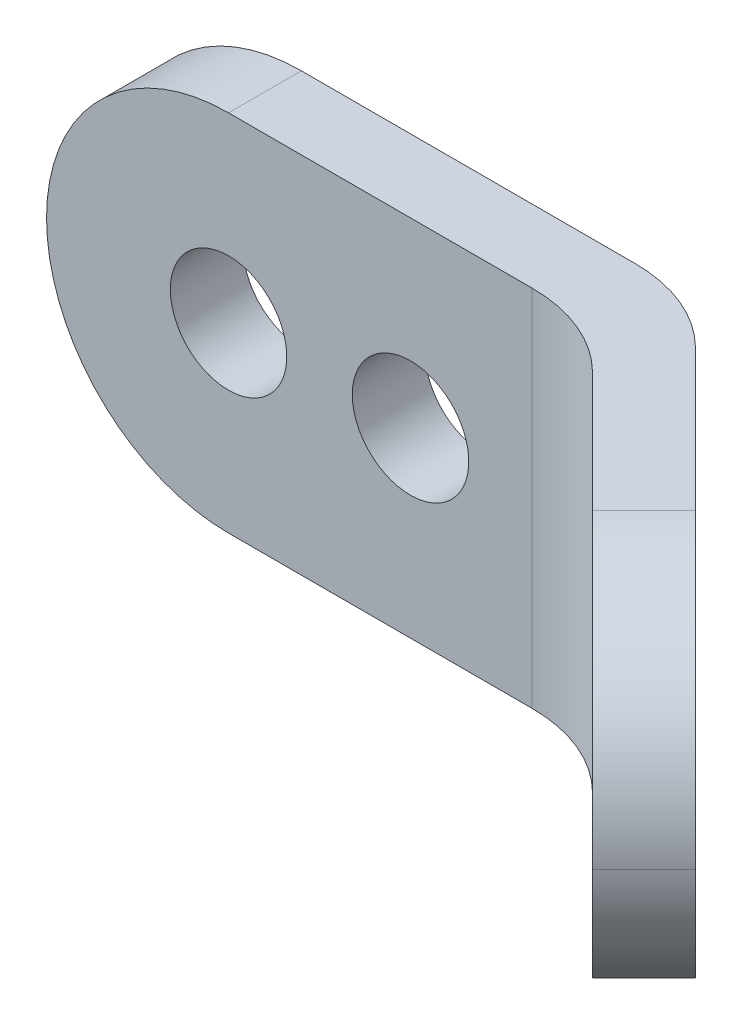
ISO-10303-21;
HEADER;
FILE_DESCRIPTION(('STEP AP214'),'2;1');
FILE_NAME('part.step','',(''),(''),'','','');
FILE_SCHEMA(('AUTOMOTIVE_DESIGN { 1 0 10303 214 1 1 1 1 }'));
ENDSEC;
DATA;
#1=APPLICATION_CONTEXT('core data for automotive mechanical design processes');
#2=APPLICATION_PROTOCOL_DEFINITION('international standard','automotive_design',2000,#1);
#3=PRODUCT_CONTEXT('',#1,'mechanical');
#4=PRODUCT('Part','Part','',(#3));
#5=PRODUCT_RELATED_PRODUCT_CATEGORY('part','',(#4));
#6=PRODUCT_DEFINITION_FORMATION('','',#4);
#7=PRODUCT_DEFINITION_CONTEXT('part definition',#1,'design');
#8=PRODUCT_DEFINITION('design','',#6,#7);
#9=PRODUCT_DEFINITION_SHAPE('','',#8);
#10=(LENGTH_UNIT() NAMED_UNIT(*) SI_UNIT(.MILLI.,.METRE.));
#11=(NAMED_UNIT(*) PLANE_ANGLE_UNIT() SI_UNIT($,.RADIAN.));
#12=(NAMED_UNIT(*) SI_UNIT($,.STERADIAN.) SOLID_ANGLE_UNIT());
#13=UNCERTAINTY_MEASURE_WITH_UNIT(LENGTH_MEASURE(1.E-05),#10,'distance_accuracy_value','');
#14=(GEOMETRIC_REPRESENTATION_CONTEXT(3) GLOBAL_UNCERTAINTY_ASSIGNED_CONTEXT((#13)) GLOBAL_UNIT_ASSIGNED_CONTEXT((#10,
#11,#12)) REPRESENTATION_CONTEXT('',''));
#15=CARTESIAN_POINT('',(0.,0.,0.));
#16=DIRECTION('',(0.,0.,1.));
#17=DIRECTION('',(1.,0.,0.));
#18=AXIS2_PLACEMENT_3D('',#15,#16,#17);
#19=CARTESIAN_POINT('',(0.,0.,0.));
#20=DIRECTION('',(0.,0.,1.));
#21=DIRECTION('',(1.,0.,0.));
#22=AXIS2_PLACEMENT_3D('',#19,#20,#21);
#23=PLANE('',#22);
#24=DIRECTION('',(1.,0.,0.));
#25=VECTOR('',#24,1.);
#26=CARTESIAN_POINT('',(12.5,-5.,0.));
#27=LINE('',#26,#25);
#28=CARTESIAN_POINT('',(-7.50000000000001,-5.00000000000001,0.));
#29=VERTEX_POINT('',#28);
#30=CARTESIAN_POINT('',(1.6715728752538,-5.,0.));
#31=VERTEX_POINT('',#30);
#32=EDGE_CURVE('E131',#29,#31,#27,.T.);
#33=ORIENTED_EDGE('',*,*,#32,.F.);
#34=CARTESIAN_POINT('',(-7.50000000000001,0.,0.));
#35=DIRECTION('',(0.,0.,1.));
#36=DIRECTION('',(1.,0.,0.));
#37=AXIS2_PLACEMENT_3D('',#34,#35,#36);
#38=CIRCLE('',#37,5.);
#39=CARTESIAN_POINT('',(-12.5,0.,0.));
#40=VERTEX_POINT('',#39);
#41=EDGE_CURVE('E56',#29,#40,#38,.F.);
#42=ORIENTED_EDGE('',*,*,#41,.T.);
#43=CARTESIAN_POINT('',(-7.50000000000001,0.,0.));
#44=DIRECTION('',(0.,0.,1.));
#45=DIRECTION('',(1.,0.,0.));
#46=AXIS2_PLACEMENT_3D('',#43,#44,#45);
#47=CIRCLE('',#46,5.);
#48=CARTESIAN_POINT('',(-7.50000000000002,5.,0.));
#49=VERTEX_POINT('',#48);
#50=EDGE_CURVE('E130',#40,#49,#47,.F.);
#51=ORIENTED_EDGE('',*,*,#50,.T.);
#52=DIRECTION('',(-1.,0.,0.));
#53=VECTOR('',#52,1.);
#54=CARTESIAN_POINT('',(12.5,5.,0.));
#55=LINE('',#54,#53);
#56=CARTESIAN_POINT('',(1.6715728752538,5.,0.));
#57=VERTEX_POINT('',#56);
#58=EDGE_CURVE('E116',#57,#49,#55,.T.);
#59=ORIENTED_EDGE('',*,*,#58,.F.);
#60=DIRECTION('',(0.,-1.,0.));
#61=VECTOR('',#60,1.);
#62=CARTESIAN_POINT('',(1.6715728752538,0.,0.));
#63=LINE('',#62,#61);
#64=EDGE_CURVE('E129',#57,#31,#63,.T.);
#65=ORIENTED_EDGE('',*,*,#64,.T.);
#66=EDGE_LOOP('',(#33,#42,#51,#59,#65));
#67=FACE_BOUND('',#66,.T.);
#68=CARTESIAN_POINT('',(-7.50000000000001,0.,0.));
#69=DIRECTION('',(0.,0.,1.));
#70=DIRECTION('',(1.,0.,0.));
#71=AXIS2_PLACEMENT_3D('',#68,#69,#70);
#72=CIRCLE('',#71,1.6);
#73=CARTESIAN_POINT('',(-5.90000000000001,0.,0.));
#74=VERTEX_POINT('',#73);
#75=EDGE_CURVE('E195',#74,#74,#72,.T.);
#76=ORIENTED_EDGE('',*,*,#75,.T.);
#77=EDGE_LOOP('',(#76));
#78=FACE_BOUND('',#77,.T.);
#79=CARTESIAN_POINT('',(-2.50000000000001,0.,0.));
#80=DIRECTION('',(0.,0.,1.));
#81=DIRECTION('',(1.,0.,0.));
#82=AXIS2_PLACEMENT_3D('',#79,#80,#81);
#83=CIRCLE('',#82,1.6);
#84=CARTESIAN_POINT('',(-0.900000000000013,0.,0.));
#85=VERTEX_POINT('',#84);
#86=EDGE_CURVE('E191',#85,#85,#83,.T.);
#87=ORIENTED_EDGE('',*,*,#86,.T.);
#88=EDGE_LOOP('',(#87));
#89=FACE_BOUND('',#88,.T.);
#90=ADVANCED_FACE('F33',(#67,#78,#89),#23,.F.);
#91=CARTESIAN_POINT('',(12.5,-5.,10.));
#92=DIRECTION('',(0.,1.,0.));
#93=DIRECTION('',(-1.,0.,0.));
#94=AXIS2_PLACEMENT_3D('',#91,#92,#93);
#95=PLANE('',#94);
#96=DIRECTION('',(-0.707106781186551,0.,-0.707106781186544));
#97=VECTOR('',#96,1.);
#98=CARTESIAN_POINT('',(3.32842712474617,-5.,0.));
#99=LINE('',#98,#97);
#100=CARTESIAN_POINT('',(8.3786796564404,-5.,5.05025253169418));
#101=VERTEX_POINT('',#100);
#102=CARTESIAN_POINT('',(4.49999999999998,-5.,1.1715728752538));
#103=VERTEX_POINT('',#102);
#104=EDGE_CURVE('E216',#101,#103,#99,.T.);
#105=ORIENTED_EDGE('',*,*,#104,.F.);
#106=DIRECTION('',(0.707106781186544,0.,-0.707106781186551));
#107=VECTOR('',#106,1.);
#108=CARTESIAN_POINT('',(7.96446609406726,-5.,5.46446609406732));
#109=LINE('',#108,#107);
#110=CARTESIAN_POINT('',(6.96446609406731,-5.,6.46446609406728));
#111=VERTEX_POINT('',#110);
#112=EDGE_CURVE('E167',#101,#111,#109,.F.);
#113=ORIENTED_EDGE('',*,*,#112,.T.);
#114=DIRECTION('',(0.707106781186551,0.,0.707106781186544));
#115=VECTOR('',#114,1.);
#116=CARTESIAN_POINT('',(10.5000000000001,-5.,10.));
#117=LINE('',#116,#115);
#118=CARTESIAN_POINT('',(3.6715728752538,-5.,3.1715728752538));
#119=VERTEX_POINT('',#118);
#120=EDGE_CURVE('E192',#119,#111,#117,.T.);
#121=ORIENTED_EDGE('',*,*,#120,.F.);
#122=CARTESIAN_POINT('',(0.843145750507621,-5.,6.));
#123=DIRECTION('',(0.,1.,0.));
#124=DIRECTION('',(-1.,0.,0.));
#125=AXIS2_PLACEMENT_3D('',#122,#123,#124);
#126=CIRCLE('',#125,4.);
#127=CARTESIAN_POINT('',(0.843145750507622,-5.,2.));
#128=VERTEX_POINT('',#127);
#129=EDGE_CURVE('E146',#119,#128,#126,.T.);
#130=ORIENTED_EDGE('',*,*,#129,.T.);
#131=DIRECTION('',(1.,0.,0.));
#132=VECTOR('',#131,1.);
#133=CARTESIAN_POINT('',(2.49999999999999,-5.,2.));
#134=LINE('',#133,#132);
#135=CARTESIAN_POINT('',(-7.50000000000001,-5.00000000000001,2.));
#136=VERTEX_POINT('',#135);
#137=EDGE_CURVE('E198',#136,#128,#134,.T.);
#138=ORIENTED_EDGE('',*,*,#137,.F.);
#139=DIRECTION('',(0.,0.,-1.));
#140=VECTOR('',#139,1.);
#141=CARTESIAN_POINT('',(-7.50000000000001,-5.00000000000001,10.));
#142=LINE('',#141,#140);
#143=EDGE_CURVE('E164',#136,#29,#142,.T.);
#144=ORIENTED_EDGE('',*,*,#143,.T.);
#145=ORIENTED_EDGE('',*,*,#32,.T.);
#146=CARTESIAN_POINT('',(1.6715728752538,-5.,4.));
#147=DIRECTION('',(0.,1.,0.));
#148=DIRECTION('',(-1.,0.,0.));
#149=AXIS2_PLACEMENT_3D('',#146,#147,#148);
#150=CIRCLE('',#149,4.);
#151=EDGE_CURVE('E136',#31,#103,#150,.F.);
#152=ORIENTED_EDGE('',*,*,#151,.T.);
#153=EDGE_LOOP('',(#105,#113,#121,#130,#138,#144,#145,#152));
#154=FACE_BOUND('',#153,.T.);
#155=ADVANCED_FACE('F207',(#154),#95,.F.);
#156=CARTESIAN_POINT('',(12.5,5.,10.));
#157=DIRECTION('',(0.,-1.,0.));
#158=DIRECTION('',(1.,0.,0.));
#159=AXIS2_PLACEMENT_3D('',#156,#157,#158);
#160=PLANE('',#159);
#161=DIRECTION('',(-0.707106781186551,0.,-0.707106781186544));
#162=VECTOR('',#161,1.);
#163=CARTESIAN_POINT('',(10.5000000000001,5.,10.));
#164=LINE('',#163,#162);
#165=CARTESIAN_POINT('',(6.96446609406731,5.,6.46446609406728));
#166=VERTEX_POINT('',#165);
#167=CARTESIAN_POINT('',(3.67157287525379,5.,3.1715728752538));
#168=VERTEX_POINT('',#167);
#169=EDGE_CURVE('E210',#166,#168,#164,.T.);
#170=ORIENTED_EDGE('',*,*,#169,.F.);
#171=DIRECTION('',(-0.707106781186544,0.,0.707106781186551));
#172=VECTOR('',#171,1.);
#173=CARTESIAN_POINT('',(7.96446609406726,5.,5.46446609406732));
#174=LINE('',#173,#172);
#175=CARTESIAN_POINT('',(8.3786796564404,5.,5.05025253169418));
#176=VERTEX_POINT('',#175);
#177=EDGE_CURVE('E158',#166,#176,#174,.F.);
#178=ORIENTED_EDGE('',*,*,#177,.T.);
#179=DIRECTION('',(0.707106781186551,0.,0.707106781186544));
#180=VECTOR('',#179,1.);
#181=CARTESIAN_POINT('',(3.32842712474617,5.,0.));
#182=LINE('',#181,#180);
#183=CARTESIAN_POINT('',(4.49999999999998,5.,1.1715728752538));
#184=VERTEX_POINT('',#183);
#185=EDGE_CURVE('E120',#184,#176,#182,.T.);
#186=ORIENTED_EDGE('',*,*,#185,.F.);
#187=CARTESIAN_POINT('',(1.6715728752538,5.,4.));
#188=DIRECTION('',(0.,-1.,0.));
#189=DIRECTION('',(1.,0.,0.));
#190=AXIS2_PLACEMENT_3D('',#187,#188,#189);
#191=CIRCLE('',#190,4.);
#192=EDGE_CURVE('E112',#184,#57,#191,.F.);
#193=ORIENTED_EDGE('',*,*,#192,.T.);
#194=ORIENTED_EDGE('',*,*,#58,.T.);
#195=DIRECTION('',(0.,0.,-1.));
#196=VECTOR('',#195,1.);
#197=CARTESIAN_POINT('',(-7.50000000000002,5.,10.));
#198=LINE('',#197,#196);
#199=CARTESIAN_POINT('',(-7.50000000000002,5.,2.));
#200=VERTEX_POINT('',#199);
#201=EDGE_CURVE('E156',#49,#200,#198,.F.);
#202=ORIENTED_EDGE('',*,*,#201,.T.);
#203=DIRECTION('',(-1.,0.,0.));
#204=VECTOR('',#203,1.);
#205=CARTESIAN_POINT('',(2.49999999999999,5.,2.));
#206=LINE('',#205,#204);
#207=CARTESIAN_POINT('',(0.843145750507621,5.,2.));
#208=VERTEX_POINT('',#207);
#209=EDGE_CURVE('E187',#208,#200,#206,.T.);
#210=ORIENTED_EDGE('',*,*,#209,.F.);
#211=CARTESIAN_POINT('',(0.84314575050762,5.,6.));
#212=DIRECTION('',(0.,-1.,0.));
#213=DIRECTION('',(1.,0.,0.));
#214=AXIS2_PLACEMENT_3D('',#211,#212,#213);
#215=CIRCLE('',#214,4.);
#216=EDGE_CURVE('E149',#208,#168,#215,.T.);
#217=ORIENTED_EDGE('',*,*,#216,.T.);
#218=EDGE_LOOP('',(#170,#178,#186,#193,#194,#202,#210,#217));
#219=FACE_BOUND('',#218,.T.);
#220=ADVANCED_FACE('F115',(#219),#160,.F.);
#221=CARTESIAN_POINT('',(-7.50000000000001,0.,10.));
#222=DIRECTION('',(0.,0.,-1.));
#223=DIRECTION('',(-1.,0.,0.));
#224=AXIS2_PLACEMENT_3D('',#221,#222,#223);
#225=CYLINDRICAL_SURFACE('',#224,1.6);
#226=CARTESIAN_POINT('',(-7.50000000000001,0.,2.));
#227=DIRECTION('',(0.,0.,-1.));
#228=DIRECTION('',(-1.,0.,0.));
#229=AXIS2_PLACEMENT_3D('',#226,#227,#228);
#230=CIRCLE('',#229,1.6);
#231=CARTESIAN_POINT('',(-9.10000000000002,0.,2.));
#232=VERTEX_POINT('',#231);
#233=EDGE_CURVE('E201',#232,#232,#230,.F.);
#234=ORIENTED_EDGE('',*,*,#233,.T.);
#235=EDGE_LOOP('',(#234));
#236=FACE_BOUND('',#235,.T.);
#237=ORIENTED_EDGE('',*,*,#75,.F.);
#238=EDGE_LOOP('',(#237));
#239=FACE_BOUND('',#238,.T.);
#240=ADVANCED_FACE('F250',(#236,#239),#225,.F.);
#241=CARTESIAN_POINT('',(-2.50000000000001,0.,10.));
#242=DIRECTION('',(0.,0.,-1.));
#243=DIRECTION('',(-1.,0.,0.));
#244=AXIS2_PLACEMENT_3D('',#241,#242,#243);
#245=CYLINDRICAL_SURFACE('',#244,1.6);
#246=CARTESIAN_POINT('',(-2.50000000000001,0.,2.));
#247=DIRECTION('',(0.,0.,-1.));
#248=DIRECTION('',(-1.,0.,0.));
#249=AXIS2_PLACEMENT_3D('',#246,#247,#248);
#250=CIRCLE('',#249,1.6);
#251=CARTESIAN_POINT('',(-4.10000000000001,0.,2.));
#252=VERTEX_POINT('',#251);
#253=EDGE_CURVE('E214',#252,#252,#250,.F.);
#254=ORIENTED_EDGE('',*,*,#253,.T.);
#255=EDGE_LOOP('',(#254));
#256=FACE_BOUND('',#255,.T.);
#257=ORIENTED_EDGE('',*,*,#86,.F.);
#258=EDGE_LOOP('',(#257));
#259=FACE_BOUND('',#258,.T.);
#260=ADVANCED_FACE('F296',(#256,#259),#245,.F.);
#261=CARTESIAN_POINT('',(10.5000000000001,5.00100000000001,10.));
#262=DIRECTION('',(0.707106781186544,0.,-0.707106781186551));
#263=DIRECTION('',(-0.707106781186551,0.,-0.707106781186544));
#264=AXIS2_PLACEMENT_3D('',#261,#262,#263);
#265=PLANE('',#264);
#266=CARTESIAN_POINT('',(8.17210857587406,0.,7.67210857587401));
#267=DIRECTION('',(0.707106781186544,0.,-0.707106781186551));
#268=DIRECTION('',(-0.707106781186551,0.,-0.707106781186544));
#269=AXIS2_PLACEMENT_3D('',#266,#267,#268);
#270=CIRCLE('',#269,2.);
#271=CARTESIAN_POINT('',(6.75789501350096,0.,6.25789501350092));
#272=VERTEX_POINT('',#271);
#273=EDGE_CURVE('E178',#272,#272,#270,.T.);
#274=ORIENTED_EDGE('',*,*,#273,.T.);
#275=EDGE_LOOP('',(#274));
#276=FACE_BOUND('',#275,.T.);
#277=CARTESIAN_POINT('',(6.96446609406731,0.,6.46446609406728));
#278=DIRECTION('',(0.707106781186544,0.,-0.707106781186551));
#279=DIRECTION('',(-0.707106781186551,0.,-0.707106781186544));
#280=AXIS2_PLACEMENT_3D('',#277,#278,#279);
#281=CIRCLE('',#280,5.);
#282=CARTESIAN_POINT('',(10.5000000000001,0.,10.));
#283=VERTEX_POINT('',#282);
#284=EDGE_CURVE('E152',#111,#283,#281,.F.);
#285=ORIENTED_EDGE('',*,*,#284,.T.);
#286=CARTESIAN_POINT('',(6.96446609406731,0.,6.46446609406728));
#287=DIRECTION('',(0.707106781186544,0.,-0.707106781186551));
#288=DIRECTION('',(-0.707106781186551,0.,-0.707106781186544));
#289=AXIS2_PLACEMENT_3D('',#286,#287,#288);
#290=CIRCLE('',#289,5.);
#291=EDGE_CURVE('E154',#283,#166,#290,.F.);
#292=ORIENTED_EDGE('',*,*,#291,.T.);
#293=ORIENTED_EDGE('',*,*,#169,.T.);
#294=DIRECTION('',(0.,-1.,0.));
#295=VECTOR('',#294,1.);
#296=CARTESIAN_POINT('',(3.6715728752538,-5.,3.1715728752538));
#297=LINE('',#296,#295);
#298=EDGE_CURVE('E124',#168,#119,#297,.T.);
#299=ORIENTED_EDGE('',*,*,#298,.T.);
#300=ORIENTED_EDGE('',*,*,#120,.T.);
#301=EDGE_LOOP('',(#285,#292,#293,#299,#300));
#302=FACE_BOUND('',#301,.T.);
#303=ADVANCED_FACE('F226',(#276,#302),#265,.F.);
#304=CARTESIAN_POINT('',(2.49999999999999,5.00100000000001,2.));
#305=DIRECTION('',(0.,0.,-1.));
#306=DIRECTION('',(-1.,0.,0.));
#307=AXIS2_PLACEMENT_3D('',#304,#305,#306);
#308=PLANE('',#307);
#309=ORIENTED_EDGE('',*,*,#253,.F.);
#310=EDGE_LOOP('',(#309));
#311=FACE_BOUND('',#310,.T.);
#312=ORIENTED_EDGE('',*,*,#233,.F.);
#313=EDGE_LOOP('',(#312));
#314=FACE_BOUND('',#313,.T.);
#315=CARTESIAN_POINT('',(-7.50000000000001,0.,2.));
#316=DIRECTION('',(0.,0.,-1.));
#317=DIRECTION('',(-1.,0.,0.));
#318=AXIS2_PLACEMENT_3D('',#315,#316,#317);
#319=CIRCLE('',#318,5.);
#320=CARTESIAN_POINT('',(-12.5,0.,2.));
#321=VERTEX_POINT('',#320);
#322=EDGE_CURVE('E42',#200,#321,#319,.F.);
#323=ORIENTED_EDGE('',*,*,#322,.T.);
#324=CARTESIAN_POINT('',(-7.50000000000001,0.,2.));
#325=DIRECTION('',(0.,0.,-1.));
#326=DIRECTION('',(-1.,0.,0.));
#327=AXIS2_PLACEMENT_3D('',#324,#325,#326);
#328=CIRCLE('',#327,5.);
#329=EDGE_CURVE('E11',#321,#136,#328,.F.);
#330=ORIENTED_EDGE('',*,*,#329,.T.);
#331=ORIENTED_EDGE('',*,*,#137,.T.);
#332=DIRECTION('',(0.,-1.,0.));
#333=VECTOR('',#332,1.);
#334=CARTESIAN_POINT('',(0.843145750507621,5.,2.));
#335=LINE('',#334,#333);
#336=EDGE_CURVE('E144',#128,#208,#335,.F.);
#337=ORIENTED_EDGE('',*,*,#336,.T.);
#338=ORIENTED_EDGE('',*,*,#209,.T.);
#339=EDGE_LOOP('',(#323,#330,#331,#337,#338));
#340=FACE_BOUND('',#339,.T.);
#341=ADVANCED_FACE('F189',(#311,#314,#340),#308,.F.);
#342=CARTESIAN_POINT('',(3.32842712474617,5.00100000000001,0.));
#343=DIRECTION('',(-0.707106781186544,0.,0.707106781186551));
#344=DIRECTION('',(0.707106781186551,0.,0.707106781186544));
#345=AXIS2_PLACEMENT_3D('',#342,#343,#344);
#346=PLANE('',#345);
#347=CARTESIAN_POINT('',(9.58632213824714,0.,6.25789501350091));
#348=DIRECTION('',(0.707106781186544,0.,-0.707106781186551));
#349=DIRECTION('',(-0.707106781186551,0.,-0.707106781186544));
#350=AXIS2_PLACEMENT_3D('',#347,#348,#349);
#351=CIRCLE('',#350,2.);
#352=CARTESIAN_POINT('',(8.17210857587404,0.,4.84368145112782));
#353=VERTEX_POINT('',#352);
#354=EDGE_CURVE('E173',#353,#353,#351,.T.);
#355=ORIENTED_EDGE('',*,*,#354,.F.);
#356=EDGE_LOOP('',(#355));
#357=FACE_BOUND('',#356,.T.);
#358=ORIENTED_EDGE('',*,*,#185,.T.);
#359=CARTESIAN_POINT('',(8.3786796564404,0.,5.05025253169418));
#360=DIRECTION('',(-0.707106781186544,0.,0.707106781186551));
#361=DIRECTION('',(0.707106781186551,0.,0.707106781186544));
#362=AXIS2_PLACEMENT_3D('',#359,#360,#361);
#363=CIRCLE('',#362,5.);
#364=CARTESIAN_POINT('',(11.9142135623732,0.,8.5857864376269));
#365=VERTEX_POINT('',#364);
#366=EDGE_CURVE('E162',#176,#365,#363,.F.);
#367=ORIENTED_EDGE('',*,*,#366,.T.);
#368=CARTESIAN_POINT('',(8.3786796564404,0.,5.05025253169418));
#369=DIRECTION('',(-0.707106781186544,0.,0.707106781186551));
#370=DIRECTION('',(0.707106781186551,0.,0.707106781186544));
#371=AXIS2_PLACEMENT_3D('',#368,#369,#370);
#372=CIRCLE('',#371,5.);
#373=EDGE_CURVE('E160',#365,#101,#372,.F.);
#374=ORIENTED_EDGE('',*,*,#373,.T.);
#375=ORIENTED_EDGE('',*,*,#104,.T.);
#376=DIRECTION('',(0.,-1.,0.));
#377=VECTOR('',#376,1.);
#378=CARTESIAN_POINT('',(4.49999999999998,5.00100000000001,1.1715728752538));
#379=LINE('',#378,#377);
#380=EDGE_CURVE('E125',#103,#184,#379,.F.);
#381=ORIENTED_EDGE('',*,*,#380,.T.);
#382=EDGE_LOOP('',(#358,#367,#374,#375,#381));
#383=FACE_BOUND('',#382,.T.);
#384=ADVANCED_FACE('F231',(#357,#383),#346,.F.);
#385=CARTESIAN_POINT('',(-3.32789142412588,0.,19.1721085758741));
#386=DIRECTION('',(0.707106781186544,0.,-0.707106781186551));
#387=DIRECTION('',(-0.707106781186551,0.,-0.707106781186544));
#388=AXIS2_PLACEMENT_3D('',#385,#386,#387);
#389=CYLINDRICAL_SURFACE('',#388,2.);
#390=ORIENTED_EDGE('',*,*,#354,.T.);
#391=EDGE_LOOP('',(#390));
#392=FACE_BOUND('',#391,.T.);
#393=ORIENTED_EDGE('',*,*,#273,.F.);
#394=EDGE_LOOP('',(#393));
#395=FACE_BOUND('',#394,.T.);
#396=ADVANCED_FACE('F229',(#392,#395),#389,.F.);
#397=CARTESIAN_POINT('',(1.6715728752538,0.,4.));
#398=DIRECTION('',(0.,-1.,0.));
#399=DIRECTION('',(1.,0.,0.));
#400=AXIS2_PLACEMENT_3D('',#397,#398,#399);
#401=CYLINDRICAL_SURFACE('',#400,4.);
#402=ORIENTED_EDGE('',*,*,#192,.F.);
#403=ORIENTED_EDGE('',*,*,#380,.F.);
#404=ORIENTED_EDGE('',*,*,#151,.F.);
#405=ORIENTED_EDGE('',*,*,#64,.F.);
#406=EDGE_LOOP('',(#402,#403,#404,#405));
#407=FACE_BOUND('',#406,.T.);
#408=ADVANCED_FACE('F134',(#407),#401,.T.);
#409=CARTESIAN_POINT('',(0.84314575050762,5.00100000000001,6.));
#410=DIRECTION('',(0.,1.,0.));
#411=DIRECTION('',(-1.,0.,0.));
#412=AXIS2_PLACEMENT_3D('',#409,#410,#411);
#413=CYLINDRICAL_SURFACE('',#412,4.);
#414=ORIENTED_EDGE('',*,*,#216,.F.);
#415=ORIENTED_EDGE('',*,*,#336,.F.);
#416=ORIENTED_EDGE('',*,*,#129,.F.);
#417=ORIENTED_EDGE('',*,*,#298,.F.);
#418=EDGE_LOOP('',(#414,#415,#416,#417));
#419=FACE_BOUND('',#418,.T.);
#420=ADVANCED_FACE('F238',(#419),#413,.F.);
#421=CARTESIAN_POINT('',(6.96446609406731,0.,6.46446609406728));
#422=DIRECTION('',(0.707106781186544,0.,-0.707106781186551));
#423=DIRECTION('',(-0.707106781186551,0.,-0.707106781186544));
#424=AXIS2_PLACEMENT_3D('',#421,#422,#423);
#425=CYLINDRICAL_SURFACE('',#424,5.);
#426=ORIENTED_EDGE('',*,*,#112,.F.);
#427=ORIENTED_EDGE('',*,*,#373,.F.);
#428=DIRECTION('',(0.707106781186544,0.,-0.707106781186551));
#429=VECTOR('',#428,1.);
#430=CARTESIAN_POINT('',(10.5000000000001,0.,10.));
#431=LINE('',#430,#429);
#432=EDGE_CURVE('E171',#283,#365,#431,.T.);
#433=ORIENTED_EDGE('',*,*,#432,.F.);
#434=ORIENTED_EDGE('',*,*,#284,.F.);
#435=EDGE_LOOP('',(#426,#427,#433,#434));
#436=FACE_BOUND('',#435,.T.);
#437=ADVANCED_FACE('F256',(#436),#425,.T.);
#438=CARTESIAN_POINT('',(6.96446609406731,0.,6.46446609406728));
#439=DIRECTION('',(-0.707106781186544,0.,0.707106781186551));
#440=DIRECTION('',(0.707106781186551,0.,0.707106781186544));
#441=AXIS2_PLACEMENT_3D('',#438,#439,#440);
#442=CYLINDRICAL_SURFACE('',#441,5.);
#443=ORIENTED_EDGE('',*,*,#366,.F.);
#444=ORIENTED_EDGE('',*,*,#177,.F.);
#445=ORIENTED_EDGE('',*,*,#291,.F.);
#446=ORIENTED_EDGE('',*,*,#432,.T.);
#447=EDGE_LOOP('',(#443,#444,#445,#446));
#448=FACE_BOUND('',#447,.T.);
#449=ADVANCED_FACE('F258',(#448),#442,.T.);
#450=CARTESIAN_POINT('',(-7.50000000000001,0.,10.));
#451=DIRECTION('',(0.,0.,-1.));
#452=DIRECTION('',(-1.,0.,0.));
#453=AXIS2_PLACEMENT_3D('',#450,#451,#452);
#454=CYLINDRICAL_SURFACE('',#453,5.);
#455=DIRECTION('',(0.,0.,-1.));
#456=VECTOR('',#455,1.);
#457=CARTESIAN_POINT('',(-12.5,0.,10.));
#458=LINE('',#457,#456);
#459=EDGE_CURVE('E37',#321,#40,#458,.T.);
#460=ORIENTED_EDGE('',*,*,#459,.F.);
#461=ORIENTED_EDGE('',*,*,#322,.F.);
#462=ORIENTED_EDGE('',*,*,#201,.F.);
#463=ORIENTED_EDGE('',*,*,#50,.F.);
#464=EDGE_LOOP('',(#460,#461,#462,#463));
#465=FACE_BOUND('',#464,.T.);
#466=ADVANCED_FACE('F35',(#465),#454,.T.);
#467=CARTESIAN_POINT('',(-7.50000000000001,0.,10.));
#468=DIRECTION('',(0.,0.,-1.));
#469=DIRECTION('',(-1.,0.,0.));
#470=AXIS2_PLACEMENT_3D('',#467,#468,#469);
#471=CYLINDRICAL_SURFACE('',#470,5.);
#472=ORIENTED_EDGE('',*,*,#329,.F.);
#473=ORIENTED_EDGE('',*,*,#459,.T.);
#474=ORIENTED_EDGE('',*,*,#41,.F.);
#475=ORIENTED_EDGE('',*,*,#143,.F.);
#476=EDGE_LOOP('',(#472,#473,#474,#475));
#477=FACE_BOUND('',#476,.T.);
#478=ADVANCED_FACE('F183',(#477),#471,.T.);
#479=CLOSED_SHELL('',(#90,#155,#220,#240,#260,#303,#341,#384,#396,#408,#420,#437,#449,#466,#478));
#480=MANIFOLD_SOLID_BREP('B2',#479);
#481=ADVANCED_BREP_SHAPE_REPRESENTATION('',(#18,#480),#14);
#482=SHAPE_DEFINITION_REPRESENTATION(#9,#481);
ENDSEC;
END-ISO-10303-21;
